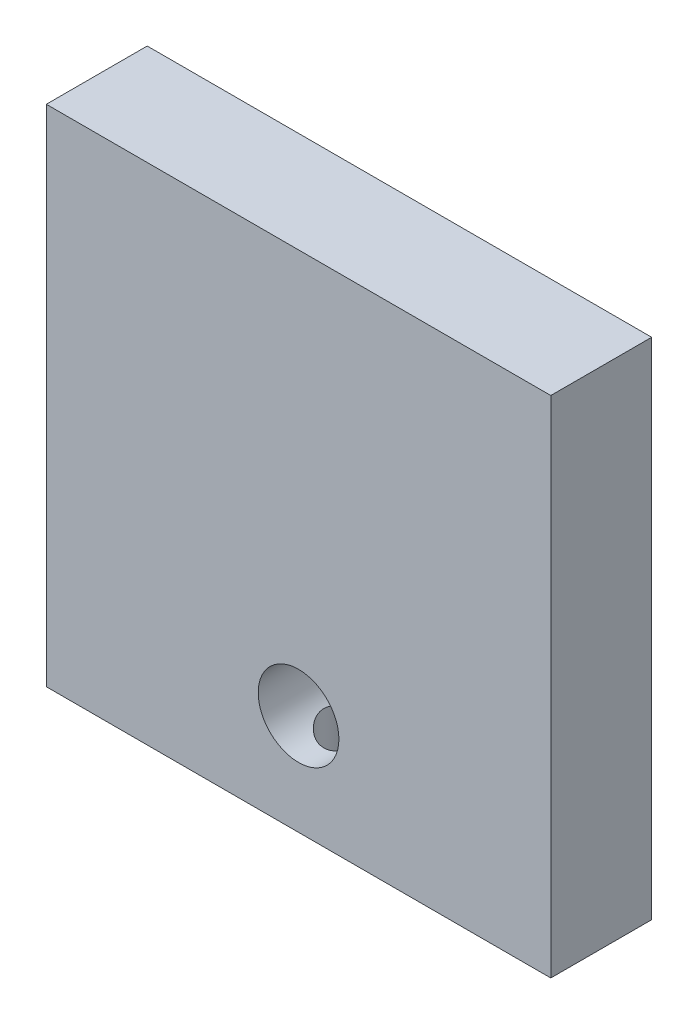
ISO-10303-21;
HEADER;
FILE_DESCRIPTION(('STEP AP214'),'2;1');
FILE_NAME('part.step','',(''),(''),'','','');
FILE_SCHEMA(('AUTOMOTIVE_DESIGN { 1 0 10303 214 1 1 1 1 }'));
ENDSEC;
DATA;
#1=APPLICATION_CONTEXT('core data for automotive mechanical design processes');
#2=APPLICATION_PROTOCOL_DEFINITION('international standard','automotive_design',2000,#1);
#3=PRODUCT_CONTEXT('',#1,'mechanical');
#4=PRODUCT('Part','Part','',(#3));
#5=PRODUCT_RELATED_PRODUCT_CATEGORY('part','',(#4));
#6=PRODUCT_DEFINITION_FORMATION('','',#4);
#7=PRODUCT_DEFINITION_CONTEXT('part definition',#1,'design');
#8=PRODUCT_DEFINITION('design','',#6,#7);
#9=PRODUCT_DEFINITION_SHAPE('','',#8);
#10=(LENGTH_UNIT() NAMED_UNIT(*) SI_UNIT(.MILLI.,.METRE.));
#11=(NAMED_UNIT(*) PLANE_ANGLE_UNIT() SI_UNIT($,.RADIAN.));
#12=(NAMED_UNIT(*) SI_UNIT($,.STERADIAN.) SOLID_ANGLE_UNIT());
#13=UNCERTAINTY_MEASURE_WITH_UNIT(LENGTH_MEASURE(1.E-05),#10,'distance_accuracy_value','');
#14=(GEOMETRIC_REPRESENTATION_CONTEXT(3) GLOBAL_UNCERTAINTY_ASSIGNED_CONTEXT((#13)) GLOBAL_UNIT_ASSIGNED_CONTEXT((#10,
#11,#12)) REPRESENTATION_CONTEXT('',''));
#15=CARTESIAN_POINT('',(0.,0.,0.));
#16=DIRECTION('',(0.,0.,1.));
#17=DIRECTION('',(1.,0.,0.));
#18=AXIS2_PLACEMENT_3D('',#15,#16,#17);
#19=CARTESIAN_POINT('',(0.,0.,10.));
#20=DIRECTION('',(1.,0.,0.));
#21=DIRECTION('',(0.,0.,-1.));
#22=AXIS2_PLACEMENT_3D('',#19,#20,#21);
#23=PLANE('',#22);
#24=DIRECTION('',(0.,-1.,0.));
#25=VECTOR('',#24,1.);
#26=CARTESIAN_POINT('',(0.,0.,0.));
#27=LINE('',#26,#25);
#28=CARTESIAN_POINT('',(0.,50.,0.));
#29=VERTEX_POINT('',#28);
#30=CARTESIAN_POINT('',(0.,0.,0.));
#31=VERTEX_POINT('',#30);
#32=EDGE_CURVE('E120',#29,#31,#27,.T.);
#33=ORIENTED_EDGE('',*,*,#32,.T.);
#34=DIRECTION('',(0.,0.,-1.));
#35=VECTOR('',#34,1.);
#36=CARTESIAN_POINT('',(0.,0.,10.));
#37=LINE('',#36,#35);
#38=CARTESIAN_POINT('',(0.,0.,10.));
#39=VERTEX_POINT('',#38);
#40=EDGE_CURVE('E12',#39,#31,#37,.T.);
#41=ORIENTED_EDGE('',*,*,#40,.F.);
#42=DIRECTION('',(0.,-1.,0.));
#43=VECTOR('',#42,1.);
#44=CARTESIAN_POINT('',(0.,0.,10.));
#45=LINE('',#44,#43);
#46=CARTESIAN_POINT('',(0.,50.,10.));
#47=VERTEX_POINT('',#46);
#48=EDGE_CURVE('E103',#47,#39,#45,.T.);
#49=ORIENTED_EDGE('',*,*,#48,.F.);
#50=DIRECTION('',(0.,0.,-1.));
#51=VECTOR('',#50,1.);
#52=CARTESIAN_POINT('',(0.,50.,10.));
#53=LINE('',#52,#51);
#54=EDGE_CURVE('E116',#47,#29,#53,.T.);
#55=ORIENTED_EDGE('',*,*,#54,.T.);
#56=EDGE_LOOP('',(#33,#41,#49,#55));
#57=FACE_BOUND('',#56,.T.);
#58=ADVANCED_FACE('F44',(#57),#23,.F.);
#59=CARTESIAN_POINT('',(0.,0.,10.));
#60=DIRECTION('',(0.,1.,0.));
#61=DIRECTION('',(0.,0.,1.));
#62=AXIS2_PLACEMENT_3D('',#59,#60,#61);
#63=PLANE('',#62);
#64=CARTESIAN_POINT('',(25.,0.,5.));
#65=DIRECTION('',(0.,-1.,0.));
#66=DIRECTION('',(0.,0.,-1.));
#67=AXIS2_PLACEMENT_3D('',#64,#65,#66);
#68=CIRCLE('',#67,2.5);
#69=CARTESIAN_POINT('',(25.,0.,2.5));
#70=VERTEX_POINT('',#69);
#71=EDGE_CURVE('E148',#70,#70,#68,.T.);
#72=ORIENTED_EDGE('',*,*,#71,.F.);
#73=EDGE_LOOP('',(#72));
#74=FACE_BOUND('',#73,.T.);
#75=DIRECTION('',(1.,0.,0.));
#76=VECTOR('',#75,1.);
#77=CARTESIAN_POINT('',(0.,0.,0.));
#78=LINE('',#77,#76);
#79=CARTESIAN_POINT('',(50.,0.,0.));
#80=VERTEX_POINT('',#79);
#81=EDGE_CURVE('E108',#31,#80,#78,.T.);
#82=ORIENTED_EDGE('',*,*,#81,.T.);
#83=DIRECTION('',(0.,0.,-1.));
#84=VECTOR('',#83,1.);
#85=CARTESIAN_POINT('',(50.,0.,10.));
#86=LINE('',#85,#84);
#87=CARTESIAN_POINT('',(50.,0.,10.));
#88=VERTEX_POINT('',#87);
#89=EDGE_CURVE('E60',#88,#80,#86,.T.);
#90=ORIENTED_EDGE('',*,*,#89,.F.);
#91=DIRECTION('',(1.,0.,0.));
#92=VECTOR('',#91,1.);
#93=CARTESIAN_POINT('',(0.,0.,10.));
#94=LINE('',#93,#92);
#95=EDGE_CURVE('E98',#39,#88,#94,.T.);
#96=ORIENTED_EDGE('',*,*,#95,.F.);
#97=ORIENTED_EDGE('',*,*,#40,.T.);
#98=EDGE_LOOP('',(#82,#90,#96,#97));
#99=FACE_BOUND('',#98,.T.);
#100=ADVANCED_FACE('F107',(#74,#99),#63,.F.);
#101=CARTESIAN_POINT('',(50.,0.,10.));
#102=DIRECTION('',(-1.,0.,0.));
#103=DIRECTION('',(0.,0.,1.));
#104=AXIS2_PLACEMENT_3D('',#101,#102,#103);
#105=PLANE('',#104);
#106=DIRECTION('',(0.,1.,0.));
#107=VECTOR('',#106,1.);
#108=CARTESIAN_POINT('',(50.,0.,0.));
#109=LINE('',#108,#107);
#110=CARTESIAN_POINT('',(50.,50.,0.));
#111=VERTEX_POINT('',#110);
#112=EDGE_CURVE('E85',#80,#111,#109,.T.);
#113=ORIENTED_EDGE('',*,*,#112,.T.);
#114=DIRECTION('',(0.,0.,-1.));
#115=VECTOR('',#114,1.);
#116=CARTESIAN_POINT('',(50.,50.,10.));
#117=LINE('',#116,#115);
#118=CARTESIAN_POINT('',(50.,50.,10.));
#119=VERTEX_POINT('',#118);
#120=EDGE_CURVE('E110',#119,#111,#117,.T.);
#121=ORIENTED_EDGE('',*,*,#120,.F.);
#122=DIRECTION('',(0.,1.,0.));
#123=VECTOR('',#122,1.);
#124=CARTESIAN_POINT('',(50.,0.,10.));
#125=LINE('',#124,#123);
#126=EDGE_CURVE('E101',#88,#119,#125,.T.);
#127=ORIENTED_EDGE('',*,*,#126,.F.);
#128=ORIENTED_EDGE('',*,*,#89,.T.);
#129=EDGE_LOOP('',(#113,#121,#127,#128));
#130=FACE_BOUND('',#129,.T.);
#131=ADVANCED_FACE('F112',(#130),#105,.F.);
#132=CARTESIAN_POINT('',(0.,50.,10.));
#133=DIRECTION('',(0.,-1.,0.));
#134=DIRECTION('',(0.,0.,-1.));
#135=AXIS2_PLACEMENT_3D('',#132,#133,#134);
#136=PLANE('',#135);
#137=DIRECTION('',(-1.,0.,0.));
#138=VECTOR('',#137,1.);
#139=CARTESIAN_POINT('',(0.,50.,0.));
#140=LINE('',#139,#138);
#141=EDGE_CURVE('E91',#111,#29,#140,.T.);
#142=ORIENTED_EDGE('',*,*,#141,.T.);
#143=ORIENTED_EDGE('',*,*,#54,.F.);
#144=DIRECTION('',(-1.,0.,0.));
#145=VECTOR('',#144,1.);
#146=CARTESIAN_POINT('',(0.,50.,10.));
#147=LINE('',#146,#145);
#148=EDGE_CURVE('E68',#119,#47,#147,.T.);
#149=ORIENTED_EDGE('',*,*,#148,.F.);
#150=ORIENTED_EDGE('',*,*,#120,.T.);
#151=EDGE_LOOP('',(#142,#143,#149,#150));
#152=FACE_BOUND('',#151,.T.);
#153=ADVANCED_FACE('F134',(#152),#136,.F.);
#154=CARTESIAN_POINT('',(0.,0.,10.));
#155=DIRECTION('',(0.,0.,-1.));
#156=DIRECTION('',(-1.,0.,0.));
#157=AXIS2_PLACEMENT_3D('',#154,#155,#156);
#158=PLANE('',#157);
#159=CARTESIAN_POINT('',(25.,10.,10.));
#160=DIRECTION('',(0.,0.,1.));
#161=DIRECTION('',(1.,0.,0.));
#162=AXIS2_PLACEMENT_3D('',#159,#160,#161);
#163=CIRCLE('',#162,4.);
#164=CARTESIAN_POINT('',(29.,10.,10.));
#165=VERTEX_POINT('',#164);
#166=EDGE_CURVE('E140',#165,#165,#163,.T.);
#167=ORIENTED_EDGE('',*,*,#166,.F.);
#168=EDGE_LOOP('',(#167));
#169=FACE_BOUND('',#168,.T.);
#170=ORIENTED_EDGE('',*,*,#48,.T.);
#171=ORIENTED_EDGE('',*,*,#95,.T.);
#172=ORIENTED_EDGE('',*,*,#126,.T.);
#173=ORIENTED_EDGE('',*,*,#148,.T.);
#174=EDGE_LOOP('',(#170,#171,#172,#173));
#175=FACE_BOUND('',#174,.T.);
#176=ADVANCED_FACE('F99',(#169,#175),#158,.F.);
#177=CARTESIAN_POINT('',(0.,0.,0.));
#178=DIRECTION('',(0.,0.,-1.));
#179=DIRECTION('',(-1.,0.,0.));
#180=AXIS2_PLACEMENT_3D('',#177,#178,#179);
#181=PLANE('',#180);
#182=CARTESIAN_POINT('',(25.,10.,0.));
#183=DIRECTION('',(0.,0.,1.));
#184=DIRECTION('',(1.,0.,0.));
#185=AXIS2_PLACEMENT_3D('',#182,#183,#184);
#186=CIRCLE('',#185,4.);
#187=CARTESIAN_POINT('',(29.,10.,0.));
#188=VERTEX_POINT('',#187);
#189=EDGE_CURVE('E124',#188,#188,#186,.T.);
#190=ORIENTED_EDGE('',*,*,#189,.T.);
#191=EDGE_LOOP('',(#190));
#192=FACE_BOUND('',#191,.T.);
#193=ORIENTED_EDGE('',*,*,#32,.F.);
#194=ORIENTED_EDGE('',*,*,#141,.F.);
#195=ORIENTED_EDGE('',*,*,#112,.F.);
#196=ORIENTED_EDGE('',*,*,#81,.F.);
#197=EDGE_LOOP('',(#193,#194,#195,#196));
#198=FACE_BOUND('',#197,.T.);
#199=ADVANCED_FACE('F137',(#192,#198),#181,.T.);
#200=CARTESIAN_POINT('',(25.,10.,0.));
#201=DIRECTION('',(0.,0.,1.));
#202=DIRECTION('',(1.,0.,0.));
#203=AXIS2_PLACEMENT_3D('',#200,#201,#202);
#204=CYLINDRICAL_SURFACE('',#203,4.);
#205=CARTESIAN_POINT('',(25.,6.,2.5));
#206=CARTESIAN_POINT('',(25.1270174765599,6.00000958666429,2.50001047614361));
#207=CARTESIAN_POINT('',(25.2541919517917,6.00611393406011,2.50974649990168));
#208=CARTESIAN_POINT('',(25.5046374566213,6.02995624447414,2.54817112968427));
#209=CARTESIAN_POINT('',(25.627900575826,6.04771638126863,2.57689586026121));
#210=CARTESIAN_POINT('',(25.8664108682692,6.09308304706437,2.65162285328754));
#211=CARTESIAN_POINT('',(25.9816944207094,6.12064081309123,2.69753960978757));
#212=CARTESIAN_POINT('',(26.2025208043499,6.18330800161723,2.80477166749147));
#213=CARTESIAN_POINT('',(26.308064713041,6.2184165873391,2.86608526255312));
#214=CARTESIAN_POINT('',(26.5159483643708,6.29659695054534,3.0077731565911));
#215=CARTESIAN_POINT('',(26.6173591161679,6.34008075782111,3.08927860270176));
#216=CARTESIAN_POINT('',(26.8059727556728,6.42937299941079,3.26643834625852));
#217=CARTESIAN_POINT('',(26.893156215944,6.47518450217043,3.36211165573893));
#218=CARTESIAN_POINT('',(27.0628574630252,6.57139162764373,3.58006778929121));
#219=CARTESIAN_POINT('',(27.1431441201832,6.62156778033854,3.70419957343094));
#220=CARTESIAN_POINT('',(27.2814793207999,6.71339603721896,3.96712963067835));
#221=CARTESIAN_POINT('',(27.3395654178744,6.7550624799954,4.10590262516798));
#222=CARTESIAN_POINT('',(27.4186680118058,6.81380848751185,4.35762104754572));
#223=CARTESIAN_POINT('',(27.4453910479468,6.83446188029115,4.46793363691832));
#224=CARTESIAN_POINT('',(27.4836368711914,6.8643728533914,4.69261185138069));
#225=CARTESIAN_POINT('',(27.4951811248564,6.87364652621544,4.80697151717321));
#226=CARTESIAN_POINT('',(27.502378366905,6.87940228465499,5.03682603287637));
#227=CARTESIAN_POINT('',(27.4979896820088,6.87585082572042,5.15232307057796));
#228=CARTESIAN_POINT('',(27.4735263334783,6.85645195116589,5.38062020872663));
#229=CARTESIAN_POINT('',(27.4534390974515,6.84059468034511,5.49341807284993));
#230=CARTESIAN_POINT('',(27.3993620946426,6.79934854177855,5.71087689674359));
#231=CARTESIAN_POINT('',(27.365700435226,6.77418571346429,5.81566487971737));
#232=CARTESIAN_POINT('',(27.2858036958951,6.71708865556582,6.01832239647321));
#233=CARTESIAN_POINT('',(27.2395641689404,6.68515203191478,6.11618946784346));
#234=CARTESIAN_POINT('',(27.1258983040726,6.61090374904342,6.32166640751016));
#235=CARTESIAN_POINT('',(27.0561277365775,6.5677684479145,6.42768105185238));
#236=CARTESIAN_POINT('',(26.9017611195864,6.47988548445286,6.6276611269764));
#237=CARTESIAN_POINT('',(26.8171498325134,6.43513620285978,6.72161400004514));
#238=CARTESIAN_POINT('',(26.6190473287773,6.34040332539404,6.91060100958261));
#239=CARTESIAN_POINT('',(26.5030944742002,6.29077428556272,7.0032559427216));
#240=CARTESIAN_POINT('',(26.2542644446851,6.1994339815933,7.16771179363101));
#241=CARTESIAN_POINT('',(26.1213939512701,6.15771960771327,7.23952090780948));
#242=CARTESIAN_POINT('',(25.9157757515674,6.10564024130098,7.32734595663498));
#243=CARTESIAN_POINT('',(25.8481935831874,6.09033125614732,7.35283428643039));
#244=CARTESIAN_POINT('',(25.7104920494785,6.06298160124555,7.39800765047864));
#245=CARTESIAN_POINT('',(25.6403741759679,6.05093904411966,7.41769603657082));
#246=CARTESIAN_POINT('',(25.4982390195385,6.03050300472151,7.45093416164239));
#247=CARTESIAN_POINT('',(25.4262235009153,6.02210625156116,7.46448940352599));
#248=CARTESIAN_POINT('',(25.2809656735607,6.0092123350867,7.48524629331357));
#249=CARTESIAN_POINT('',(25.2077235765708,6.00471450564147,7.4924490265473));
#250=CARTESIAN_POINT('',(25.0091191768968,5.99806226525833,7.50310930464354));
#251=CARTESIAN_POINT('',(24.8832179832943,5.999761877634,7.50040036312351));
#252=CARTESIAN_POINT('',(24.6340322339883,6.01481686591695,7.47624033553455));
#253=CARTESIAN_POINT('',(24.5107475006401,6.02817144789898,7.45479052607527));
#254=CARTESIAN_POINT('',(24.2749638059974,6.06452024444631,7.39552141201722));
#255=CARTESIAN_POINT('',(24.1622315789371,6.08711693628874,7.35837527923021));
#256=CARTESIAN_POINT('',(23.9447218387467,6.14008597102126,7.26940762868757));
#257=CARTESIAN_POINT('',(23.839945661384,6.17045961588358,7.21758365349857));
#258=CARTESIAN_POINT('',(23.6298323803081,6.24019985979342,7.09496946249217));
#259=CARTESIAN_POINT('',(23.525506197031,6.28016473244628,7.02279282772497));
#260=CARTESIAN_POINT('',(23.3297145866993,6.36386057114274,6.86441230353071));
#261=CARTESIAN_POINT('',(23.2382636596198,6.40759569526866,6.77819283111431));
#262=CARTESIAN_POINT('',(23.0570516472375,6.50188261513271,6.57972991015434));
#263=CARTESIAN_POINT('',(22.9694629726636,6.55250233420809,6.46552558450248));
#264=CARTESIAN_POINT('',(22.8143929508356,6.64866474253108,6.22224843301743));
#265=CARTESIAN_POINT('',(22.7468976830623,6.69421093291631,6.09318598710868));
#266=CARTESIAN_POINT('',(22.6463045617898,6.76532939421161,5.85061570340043));
#267=CARTESIAN_POINT('',(22.6089620827932,6.79308727636196,5.73951849861129));
#268=CARTESIAN_POINT('',(22.5499978357925,6.83789938648748,5.51121370838655));
#269=CARTESIAN_POINT('',(22.5283515019475,6.8549703347018,5.39401598031057));
#270=CARTESIAN_POINT('',(22.5019723253077,6.875873500674,5.1558194470296));
#271=CARTESIAN_POINT('',(22.4973362541353,6.87962996806835,5.03480283212007));
#272=CARTESIAN_POINT('',(22.5056044322647,6.87301873624282,4.79373807617048));
#273=CARTESIAN_POINT('',(22.5185145117854,6.86264634229521,4.67369027038064));
#274=CARTESIAN_POINT('',(22.559234529139,6.83089222990011,4.44794042056389));
#275=CARTESIAN_POINT('',(22.5857615280828,6.81046385810926,4.34186143549762));
#276=CARTESIAN_POINT('',(22.6516476125657,6.76164937214775,4.13572984248174));
#277=CARTESIAN_POINT('',(22.6910120490922,6.73325994028691,4.03567976818272));
#278=CARTESIAN_POINT('',(22.7879458419604,6.66672202382148,3.82880667566186));
#279=CARTESIAN_POINT('',(22.8473257201833,6.6277557147592,3.72310005373626));
#280=CARTESIAN_POINT('',(22.9800010511079,6.54664554676005,3.52212261429074));
#281=CARTESIAN_POINT('',(23.0533077540531,6.50449913561001,3.42686033262592));
#282=CARTESIAN_POINT('',(23.2286533031406,6.41196324573154,3.22997441620157));
#283=CARTESIAN_POINT('',(23.3335071551011,6.36159511739722,3.13083023846071));
#284=CARTESIAN_POINT('',(23.5603806200915,6.2660194616177,2.95099840387494));
#285=CARTESIAN_POINT('',(23.6824107880335,6.22081513852742,2.87032217632248));
#286=CARTESIAN_POINT('',(23.8765364205745,6.16040785271585,2.76543656144125));
#287=CARTESIAN_POINT('',(23.9432039884191,6.14148165842943,2.73312519995301));
#288=CARTESIAN_POINT('',(24.0798004156259,6.10664834602118,2.67432774817621));
#289=CARTESIAN_POINT('',(24.149727366068,6.0907394877408,2.6478382988649));
#290=CARTESIAN_POINT('',(24.2921263115622,6.06246625824483,2.60114285553784));
#291=CARTESIAN_POINT('',(24.3645908554277,6.05009235034817,2.58091994275434));
#292=CARTESIAN_POINT('',(24.5115430104429,6.02924322541941,2.54702454441763));
#293=CARTESIAN_POINT('',(24.5860290864545,6.02076513307077,2.53334722756052));
#294=CARTESIAN_POINT('',(24.717147394906,6.00961728708229,2.51540958977327));
#295=CARTESIAN_POINT('',(24.7734984840851,6.00601840482405,2.50963846974782));
#296=CARTESIAN_POINT('',(24.886555925481,6.00120754627068,2.50193121637285));
#297=CARTESIAN_POINT('',(24.9432622994687,5.99999571771301,2.49999532038964));
#298=CARTESIAN_POINT('',(25.,6.,2.5));
#299=B_SPLINE_CURVE_WITH_KNOTS('',3,(#205,#206,#207,#208,#209,#210,#211,#212,#213,#214,#215,
#216,#217,#218,#219,#220,#221,#222,#223,#224,#225,#226,#227,#228,#229,#230,#231,#232,#233,#234,
#235,#236,#237,#238,#239,#240,#241,#242,#243,#244,#245,#246,#247,#248,#249,#250,#251,#252,#253,
#254,#255,#256,#257,#258,#259,#260,#261,#262,#263,#264,#265,#266,#267,#268,#269,#270,#271,#272,
#273,#274,#275,#276,#277,#278,#279,#280,#281,#282,#283,#284,#285,#286,#287,#288,#289,#290,#291,
#292,#293,#294,#295,#296,#297,#298),.UNSPECIFIED.,.T.,.F.,(4,2,2,2,2,2,2,2,2,2,2,2,2,2,2,2,2,2,
2,2,2,2,2,2,2,2,2,2,2,2,2,2,2,2,2,2,2,2,2,2,2,2,2,2,2,2,4),(0.,0.380824602868266,
0.762375788256924,1.14205397519027,1.52169010807759,1.93164374107244,2.34215256651403,
2.80825951705947,3.27357449214021,3.61824017759434,3.96241789414781,4.30749646997556,
4.65285169010166,4.99031678920873,5.32790135816066,5.72854900708719,6.12961045150363,
6.59684361399043,7.06389281455722,7.28510978359955,7.50619865744382,7.72708876613707,
7.94794112831293,8.32363778110177,8.69930884379592,9.06028425977628,9.42132014771964,
9.81879878896136,10.216721545704,10.6724083464246,11.1277787130885,11.4876929754247,
11.8470427174174,12.2084336629143,12.5699447204276,12.9023575499051,13.2349091154192,
13.6156046298899,13.9966089922257,14.4531049498525,14.9098826607203,15.138984863948,
15.3679545348469,15.5963005225022,15.8244777070605,15.994578512822,16.1646898459841),.UNSPECIFIED.);
#300=CARTESIAN_POINT('',(25.,6.,2.5));
#301=VERTEX_POINT('',#300);
#302=EDGE_CURVE('E47',#301,#301,#299,.T.);
#303=ORIENTED_EDGE('',*,*,#302,.T.);
#304=EDGE_LOOP('',(#303));
#305=FACE_BOUND('',#304,.T.);
#306=ORIENTED_EDGE('',*,*,#189,.F.);
#307=EDGE_LOOP('',(#306));
#308=FACE_BOUND('',#307,.T.);
#309=ORIENTED_EDGE('',*,*,#166,.T.);
#310=EDGE_LOOP('',(#309));
#311=FACE_BOUND('',#310,.T.);
#312=ADVANCED_FACE('F161',(#305,#308,#311),#204,.F.);
#313=CARTESIAN_POINT('',(25.,10.,5.));
#314=DIRECTION('',(0.,-1.,0.));
#315=DIRECTION('',(0.,0.,-1.));
#316=AXIS2_PLACEMENT_3D('',#313,#314,#315);
#317=CYLINDRICAL_SURFACE('',#316,2.5);
#318=ORIENTED_EDGE('',*,*,#71,.T.);
#319=EDGE_LOOP('',(#318));
#320=FACE_BOUND('',#319,.T.);
#321=ORIENTED_EDGE('',*,*,#302,.F.);
#322=EDGE_LOOP('',(#321));
#323=FACE_BOUND('',#322,.T.);
#324=ADVANCED_FACE('F164',(#320,#323),#317,.F.);
#325=CLOSED_SHELL('',(#58,#100,#131,#153,#176,#199,#312,#324));
#326=MANIFOLD_SOLID_BREP('B2',#325);
#327=ADVANCED_BREP_SHAPE_REPRESENTATION('',(#18,#326),#14);
#328=SHAPE_DEFINITION_REPRESENTATION(#9,#327);
ENDSEC;
END-ISO-10303-21;
